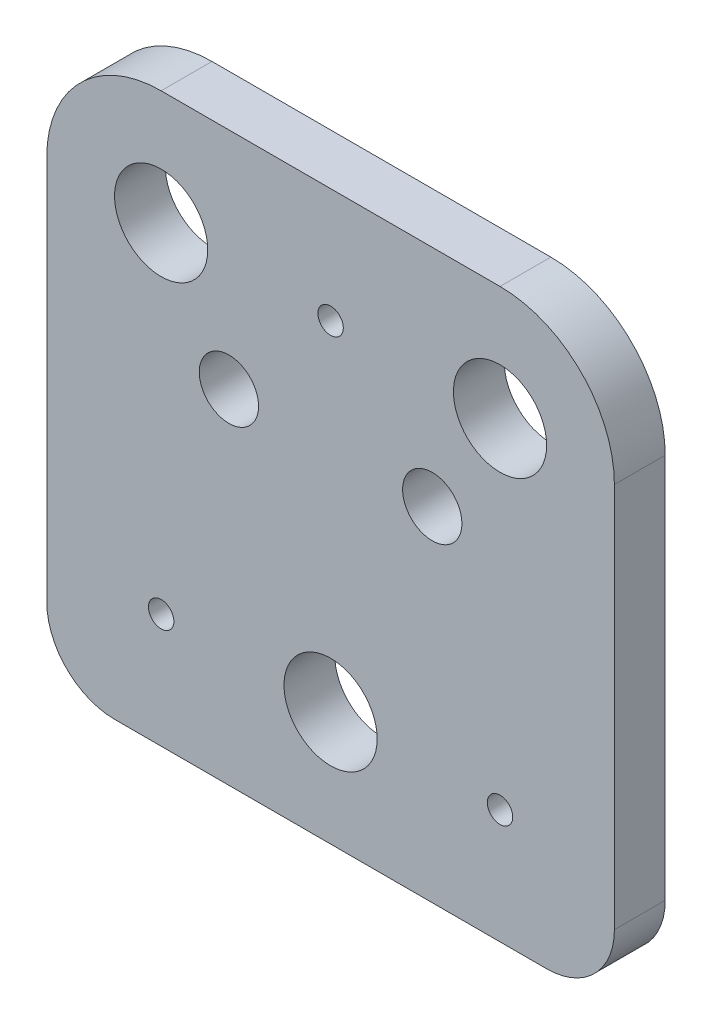
ISO-10303-21;
HEADER;
FILE_DESCRIPTION(('STEP AP214'),'2;1');
FILE_NAME('part.step','',(''),(''),'','','');
FILE_SCHEMA(('AUTOMOTIVE_DESIGN { 1 0 10303 214 1 1 1 1 }'));
ENDSEC;
DATA;
#1=APPLICATION_CONTEXT('core data for automotive mechanical design processes');
#2=APPLICATION_PROTOCOL_DEFINITION('international standard','automotive_design',2000,#1);
#3=PRODUCT_CONTEXT('',#1,'mechanical');
#4=PRODUCT('Part','Part','',(#3));
#5=PRODUCT_RELATED_PRODUCT_CATEGORY('part','',(#4));
#6=PRODUCT_DEFINITION_FORMATION('','',#4);
#7=PRODUCT_DEFINITION_CONTEXT('part definition',#1,'design');
#8=PRODUCT_DEFINITION('design','',#6,#7);
#9=PRODUCT_DEFINITION_SHAPE('','',#8);
#10=(LENGTH_UNIT() NAMED_UNIT(*) SI_UNIT(.MILLI.,.METRE.));
#11=(NAMED_UNIT(*) PLANE_ANGLE_UNIT() SI_UNIT($,.RADIAN.));
#12=(NAMED_UNIT(*) SI_UNIT($,.STERADIAN.) SOLID_ANGLE_UNIT());
#13=UNCERTAINTY_MEASURE_WITH_UNIT(LENGTH_MEASURE(1.E-05),#10,'distance_accuracy_value','');
#14=(GEOMETRIC_REPRESENTATION_CONTEXT(3) GLOBAL_UNCERTAINTY_ASSIGNED_CONTEXT((#13)) GLOBAL_UNIT_ASSIGNED_CONTEXT((#10,
#11,#12)) REPRESENTATION_CONTEXT('',''));
#15=CARTESIAN_POINT('',(0.,0.,0.));
#16=DIRECTION('',(0.,0.,1.));
#17=DIRECTION('',(1.,0.,0.));
#18=AXIS2_PLACEMENT_3D('',#15,#16,#17);
#19=CARTESIAN_POINT('',(20.,20.,6.));
#20=DIRECTION('',(0.,0.,1.));
#21=DIRECTION('',(1.,0.,0.));
#22=AXIS2_PLACEMENT_3D('',#19,#20,#21);
#23=PLANE('',#22);
#24=CARTESIAN_POINT('',(-12.,6.99999999999999,6.));
#25=DIRECTION('',(0.,0.,1.));
#26=DIRECTION('',(1.,0.,0.));
#27=AXIS2_PLACEMENT_3D('',#24,#25,#26);
#28=CIRCLE('',#27,3.5);
#29=CARTESIAN_POINT('',(-8.49999999999998,6.99999999999999,6.));
#30=VERTEX_POINT('',#29);
#31=EDGE_CURVE('E218',#30,#30,#28,.T.);
#32=ORIENTED_EDGE('',*,*,#31,.F.);
#33=EDGE_LOOP('',(#32));
#34=FACE_BOUND('',#33,.T.);
#35=CARTESIAN_POINT('',(12.,6.99999999999999,6.));
#36=DIRECTION('',(0.,0.,1.));
#37=DIRECTION('',(1.,0.,0.));
#38=AXIS2_PLACEMENT_3D('',#35,#36,#37);
#39=CIRCLE('',#38,3.5);
#40=CARTESIAN_POINT('',(15.5,6.99999999999999,6.));
#41=VERTEX_POINT('',#40);
#42=EDGE_CURVE('E219',#41,#41,#39,.T.);
#43=ORIENTED_EDGE('',*,*,#42,.F.);
#44=EDGE_LOOP('',(#43));
#45=FACE_BOUND('',#44,.T.);
#46=CARTESIAN_POINT('',(-20.,-20.,6.));
#47=DIRECTION('',(0.,0.,1.));
#48=DIRECTION('',(1.,0.,0.));
#49=AXIS2_PLACEMENT_3D('',#46,#47,#48);
#50=CIRCLE('',#49,1.5);
#51=CARTESIAN_POINT('',(-18.5,-20.,6.));
#52=VERTEX_POINT('',#51);
#53=EDGE_CURVE('E194',#52,#52,#50,.F.);
#54=ORIENTED_EDGE('',*,*,#53,.T.);
#55=EDGE_LOOP('',(#54));
#56=FACE_BOUND('',#55,.T.);
#57=CARTESIAN_POINT('',(20.,-20.,6.));
#58=DIRECTION('',(0.,0.,1.));
#59=DIRECTION('',(1.,0.,0.));
#60=AXIS2_PLACEMENT_3D('',#57,#58,#59);
#61=CIRCLE('',#60,1.5);
#62=CARTESIAN_POINT('',(21.5,-20.,6.));
#63=VERTEX_POINT('',#62);
#64=EDGE_CURVE('E205',#63,#63,#61,.F.);
#65=ORIENTED_EDGE('',*,*,#64,.T.);
#66=EDGE_LOOP('',(#65));
#67=FACE_BOUND('',#66,.T.);
#68=CARTESIAN_POINT('',(0.,20.,6.));
#69=DIRECTION('',(0.,0.,1.));
#70=DIRECTION('',(1.,0.,0.));
#71=AXIS2_PLACEMENT_3D('',#68,#69,#70);
#72=CIRCLE('',#71,1.5);
#73=CARTESIAN_POINT('',(1.5,20.,6.));
#74=VERTEX_POINT('',#73);
#75=EDGE_CURVE('E197',#74,#74,#72,.F.);
#76=ORIENTED_EDGE('',*,*,#75,.T.);
#77=EDGE_LOOP('',(#76));
#78=FACE_BOUND('',#77,.T.);
#79=DIRECTION('',(0.,-1.,0.));
#80=VECTOR('',#79,1.);
#81=CARTESIAN_POINT('',(-33.5,-20.,6.));
#82=LINE('',#81,#80);
#83=CARTESIAN_POINT('',(-33.5,20.,6.));
#84=VERTEX_POINT('',#83);
#85=CARTESIAN_POINT('',(-33.5,-25.5,6.));
#86=VERTEX_POINT('',#85);
#87=EDGE_CURVE('E142',#84,#86,#82,.T.);
#88=ORIENTED_EDGE('',*,*,#87,.T.);
#89=CARTESIAN_POINT('',(-25.5,-25.5,6.));
#90=DIRECTION('',(0.,0.,1.));
#91=DIRECTION('',(1.,0.,0.));
#92=AXIS2_PLACEMENT_3D('',#89,#90,#91);
#93=CIRCLE('',#92,8.);
#94=CARTESIAN_POINT('',(-25.5,-33.5,6.));
#95=VERTEX_POINT('',#94);
#96=EDGE_CURVE('E41',#86,#95,#93,.T.);
#97=ORIENTED_EDGE('',*,*,#96,.T.);
#98=DIRECTION('',(1.,0.,0.));
#99=VECTOR('',#98,1.);
#100=CARTESIAN_POINT('',(20.,-33.5,6.));
#101=LINE('',#100,#99);
#102=CARTESIAN_POINT('',(25.5,-33.5,6.));
#103=VERTEX_POINT('',#102);
#104=EDGE_CURVE('E141',#95,#103,#101,.T.);
#105=ORIENTED_EDGE('',*,*,#104,.T.);
#106=CARTESIAN_POINT('',(25.5,-25.5,6.));
#107=DIRECTION('',(0.,0.,1.));
#108=DIRECTION('',(1.,0.,0.));
#109=AXIS2_PLACEMENT_3D('',#106,#107,#108);
#110=CIRCLE('',#109,8.);
#111=CARTESIAN_POINT('',(33.5,-25.5,6.));
#112=VERTEX_POINT('',#111);
#113=EDGE_CURVE('E48',#103,#112,#110,.T.);
#114=ORIENTED_EDGE('',*,*,#113,.T.);
#115=DIRECTION('',(0.,1.,0.));
#116=VECTOR('',#115,1.);
#117=CARTESIAN_POINT('',(33.5,-20.,6.));
#118=LINE('',#117,#116);
#119=CARTESIAN_POINT('',(33.5,20.,6.));
#120=VERTEX_POINT('',#119);
#121=EDGE_CURVE('E115',#112,#120,#118,.T.);
#122=ORIENTED_EDGE('',*,*,#121,.T.);
#123=CARTESIAN_POINT('',(20.,20.,6.));
#124=DIRECTION('',(0.,0.,1.));
#125=DIRECTION('',(1.,0.,0.));
#126=AXIS2_PLACEMENT_3D('',#123,#124,#125);
#127=CIRCLE('',#126,13.5);
#128=CARTESIAN_POINT('',(20.,33.5,6.));
#129=VERTEX_POINT('',#128);
#130=EDGE_CURVE('E111',#120,#129,#127,.T.);
#131=ORIENTED_EDGE('',*,*,#130,.T.);
#132=DIRECTION('',(-1.,0.,0.));
#133=VECTOR('',#132,1.);
#134=CARTESIAN_POINT('',(-20.,33.5,6.));
#135=LINE('',#134,#133);
#136=CARTESIAN_POINT('',(-20.,33.5,6.));
#137=VERTEX_POINT('',#136);
#138=EDGE_CURVE('E101',#129,#137,#135,.T.);
#139=ORIENTED_EDGE('',*,*,#138,.T.);
#140=CARTESIAN_POINT('',(-20.,20.,6.));
#141=DIRECTION('',(0.,0.,1.));
#142=DIRECTION('',(1.,0.,0.));
#143=AXIS2_PLACEMENT_3D('',#140,#141,#142);
#144=CIRCLE('',#143,13.5);
#145=EDGE_CURVE('E110',#137,#84,#144,.T.);
#146=ORIENTED_EDGE('',*,*,#145,.T.);
#147=EDGE_LOOP('',(#88,#97,#105,#114,#122,#131,#139,#146));
#148=FACE_BOUND('',#147,.T.);
#149=CARTESIAN_POINT('',(20.,20.,6.));
#150=DIRECTION('',(0.,0.,1.));
#151=DIRECTION('',(1.,0.,0.));
#152=AXIS2_PLACEMENT_3D('',#149,#150,#151);
#153=CIRCLE('',#152,5.5);
#154=CARTESIAN_POINT('',(25.5,20.,6.));
#155=VERTEX_POINT('',#154);
#156=EDGE_CURVE('E182',#155,#155,#153,.T.);
#157=ORIENTED_EDGE('',*,*,#156,.F.);
#158=EDGE_LOOP('',(#157));
#159=FACE_BOUND('',#158,.T.);
#160=CARTESIAN_POINT('',(-20.,20.,6.));
#161=DIRECTION('',(0.,0.,1.));
#162=DIRECTION('',(1.,0.,0.));
#163=AXIS2_PLACEMENT_3D('',#160,#161,#162);
#164=CIRCLE('',#163,5.5);
#165=CARTESIAN_POINT('',(-14.5,20.,6.));
#166=VERTEX_POINT('',#165);
#167=EDGE_CURVE('E174',#166,#166,#164,.T.);
#168=ORIENTED_EDGE('',*,*,#167,.F.);
#169=EDGE_LOOP('',(#168));
#170=FACE_BOUND('',#169,.T.);
#171=CARTESIAN_POINT('',(0.,-20.,6.));
#172=DIRECTION('',(0.,0.,1.));
#173=DIRECTION('',(1.,0.,0.));
#174=AXIS2_PLACEMENT_3D('',#171,#172,#173);
#175=CIRCLE('',#174,5.5);
#176=CARTESIAN_POINT('',(5.5,-20.,6.));
#177=VERTEX_POINT('',#176);
#178=EDGE_CURVE('E188',#177,#177,#175,.T.);
#179=ORIENTED_EDGE('',*,*,#178,.F.);
#180=EDGE_LOOP('',(#179));
#181=FACE_BOUND('',#180,.T.);
#182=ADVANCED_FACE('F33',(#34,#45,#56,#67,#78,#148,#159,#170,#181),#23,.T.);
#183=CARTESIAN_POINT('',(20.,20.,0.));
#184=DIRECTION('',(0.,0.,1.));
#185=DIRECTION('',(1.,0.,0.));
#186=AXIS2_PLACEMENT_3D('',#183,#184,#185);
#187=PLANE('',#186);
#188=CARTESIAN_POINT('',(-12.,6.99999999999999,0.));
#189=DIRECTION('',(0.,0.,1.));
#190=DIRECTION('',(1.,0.,0.));
#191=AXIS2_PLACEMENT_3D('',#188,#189,#190);
#192=CIRCLE('',#191,3.5);
#193=CARTESIAN_POINT('',(-8.49999999999998,6.99999999999999,0.));
#194=VERTEX_POINT('',#193);
#195=EDGE_CURVE('E204',#194,#194,#192,.F.);
#196=ORIENTED_EDGE('',*,*,#195,.F.);
#197=EDGE_LOOP('',(#196));
#198=FACE_BOUND('',#197,.T.);
#199=CARTESIAN_POINT('',(12.,6.99999999999999,0.));
#200=DIRECTION('',(0.,0.,1.));
#201=DIRECTION('',(1.,0.,0.));
#202=AXIS2_PLACEMENT_3D('',#199,#200,#201);
#203=CIRCLE('',#202,3.5);
#204=CARTESIAN_POINT('',(15.5,6.99999999999999,0.));
#205=VERTEX_POINT('',#204);
#206=EDGE_CURVE('E215',#205,#205,#203,.F.);
#207=ORIENTED_EDGE('',*,*,#206,.F.);
#208=EDGE_LOOP('',(#207));
#209=FACE_BOUND('',#208,.T.);
#210=CARTESIAN_POINT('',(-20.,-20.,0.));
#211=DIRECTION('',(0.,0.,-1.));
#212=DIRECTION('',(-1.,0.,0.));
#213=AXIS2_PLACEMENT_3D('',#210,#211,#212);
#214=CIRCLE('',#213,1.5);
#215=CARTESIAN_POINT('',(-21.5,-20.,0.));
#216=VERTEX_POINT('',#215);
#217=EDGE_CURVE('E208',#216,#216,#214,.T.);
#218=ORIENTED_EDGE('',*,*,#217,.F.);
#219=EDGE_LOOP('',(#218));
#220=FACE_BOUND('',#219,.T.);
#221=CARTESIAN_POINT('',(20.,-20.,0.));
#222=DIRECTION('',(0.,0.,-1.));
#223=DIRECTION('',(-1.,0.,0.));
#224=AXIS2_PLACEMENT_3D('',#221,#222,#223);
#225=CIRCLE('',#224,1.5);
#226=CARTESIAN_POINT('',(18.5,-20.,0.));
#227=VERTEX_POINT('',#226);
#228=EDGE_CURVE('E200',#227,#227,#225,.T.);
#229=ORIENTED_EDGE('',*,*,#228,.F.);
#230=EDGE_LOOP('',(#229));
#231=FACE_BOUND('',#230,.T.);
#232=CARTESIAN_POINT('',(0.,20.,0.));
#233=DIRECTION('',(0.,0.,-1.));
#234=DIRECTION('',(-1.,0.,0.));
#235=AXIS2_PLACEMENT_3D('',#232,#233,#234);
#236=CIRCLE('',#235,1.5);
#237=CARTESIAN_POINT('',(-1.5,20.,0.));
#238=VERTEX_POINT('',#237);
#239=EDGE_CURVE('E201',#238,#238,#236,.T.);
#240=ORIENTED_EDGE('',*,*,#239,.F.);
#241=EDGE_LOOP('',(#240));
#242=FACE_BOUND('',#241,.T.);
#243=DIRECTION('',(1.,0.,0.));
#244=VECTOR('',#243,1.);
#245=CARTESIAN_POINT('',(20.,-33.5,0.));
#246=LINE('',#245,#244);
#247=CARTESIAN_POINT('',(-25.5,-33.5,0.));
#248=VERTEX_POINT('',#247);
#249=CARTESIAN_POINT('',(25.5,-33.5,0.));
#250=VERTEX_POINT('',#249);
#251=EDGE_CURVE('E158',#248,#250,#246,.T.);
#252=ORIENTED_EDGE('',*,*,#251,.F.);
#253=CARTESIAN_POINT('',(-25.5,-25.5,0.));
#254=DIRECTION('',(0.,0.,1.));
#255=DIRECTION('',(1.,0.,0.));
#256=AXIS2_PLACEMENT_3D('',#253,#254,#255);
#257=CIRCLE('',#256,8.);
#258=CARTESIAN_POINT('',(-33.5,-25.5,0.));
#259=VERTEX_POINT('',#258);
#260=EDGE_CURVE('E136',#248,#259,#257,.F.);
#261=ORIENTED_EDGE('',*,*,#260,.T.);
#262=DIRECTION('',(0.,-1.,0.));
#263=VECTOR('',#262,1.);
#264=CARTESIAN_POINT('',(-33.5,-20.,0.));
#265=LINE('',#264,#263);
#266=CARTESIAN_POINT('',(-33.5,20.,0.));
#267=VERTEX_POINT('',#266);
#268=EDGE_CURVE('E157',#267,#259,#265,.T.);
#269=ORIENTED_EDGE('',*,*,#268,.F.);
#270=CARTESIAN_POINT('',(-20.,20.,0.));
#271=DIRECTION('',(0.,0.,1.));
#272=DIRECTION('',(1.,0.,0.));
#273=AXIS2_PLACEMENT_3D('',#270,#271,#272);
#274=CIRCLE('',#273,13.5);
#275=CARTESIAN_POINT('',(-20.,33.5,0.));
#276=VERTEX_POINT('',#275);
#277=EDGE_CURVE('E162',#276,#267,#274,.T.);
#278=ORIENTED_EDGE('',*,*,#277,.F.);
#279=DIRECTION('',(-1.,0.,0.));
#280=VECTOR('',#279,1.);
#281=CARTESIAN_POINT('',(-20.,33.5,0.));
#282=LINE('',#281,#280);
#283=CARTESIAN_POINT('',(20.,33.5,0.));
#284=VERTEX_POINT('',#283);
#285=EDGE_CURVE('E165',#284,#276,#282,.T.);
#286=ORIENTED_EDGE('',*,*,#285,.F.);
#287=CARTESIAN_POINT('',(20.,20.,0.));
#288=DIRECTION('',(0.,0.,1.));
#289=DIRECTION('',(1.,0.,0.));
#290=AXIS2_PLACEMENT_3D('',#287,#288,#289);
#291=CIRCLE('',#290,13.5);
#292=CARTESIAN_POINT('',(33.5,20.,0.));
#293=VERTEX_POINT('',#292);
#294=EDGE_CURVE('E123',#293,#284,#291,.T.);
#295=ORIENTED_EDGE('',*,*,#294,.F.);
#296=DIRECTION('',(0.,1.,0.));
#297=VECTOR('',#296,1.);
#298=CARTESIAN_POINT('',(33.5,-20.,0.));
#299=LINE('',#298,#297);
#300=CARTESIAN_POINT('',(33.5,-25.5,0.));
#301=VERTEX_POINT('',#300);
#302=EDGE_CURVE('E119',#301,#293,#299,.T.);
#303=ORIENTED_EDGE('',*,*,#302,.F.);
#304=CARTESIAN_POINT('',(25.5,-25.5,0.));
#305=DIRECTION('',(0.,0.,1.));
#306=DIRECTION('',(1.,0.,0.));
#307=AXIS2_PLACEMENT_3D('',#304,#305,#306);
#308=CIRCLE('',#307,8.);
#309=EDGE_CURVE('E134',#301,#250,#308,.F.);
#310=ORIENTED_EDGE('',*,*,#309,.T.);
#311=EDGE_LOOP('',(#252,#261,#269,#278,#286,#295,#303,#310));
#312=FACE_BOUND('',#311,.T.);
#313=CARTESIAN_POINT('',(-20.,20.,0.));
#314=DIRECTION('',(0.,0.,1.));
#315=DIRECTION('',(1.,0.,0.));
#316=AXIS2_PLACEMENT_3D('',#313,#314,#315);
#317=CIRCLE('',#316,5.5);
#318=CARTESIAN_POINT('',(-14.5,20.,0.));
#319=VERTEX_POINT('',#318);
#320=EDGE_CURVE('E179',#319,#319,#317,.T.);
#321=ORIENTED_EDGE('',*,*,#320,.T.);
#322=EDGE_LOOP('',(#321));
#323=FACE_BOUND('',#322,.T.);
#324=CARTESIAN_POINT('',(20.,20.,0.));
#325=DIRECTION('',(0.,0.,1.));
#326=DIRECTION('',(1.,0.,0.));
#327=AXIS2_PLACEMENT_3D('',#324,#325,#326);
#328=CIRCLE('',#327,5.5);
#329=CARTESIAN_POINT('',(25.5,20.,0.));
#330=VERTEX_POINT('',#329);
#331=EDGE_CURVE('E185',#330,#330,#328,.T.);
#332=ORIENTED_EDGE('',*,*,#331,.T.);
#333=EDGE_LOOP('',(#332));
#334=FACE_BOUND('',#333,.T.);
#335=CARTESIAN_POINT('',(0.,-20.,0.));
#336=DIRECTION('',(0.,0.,1.));
#337=DIRECTION('',(1.,0.,0.));
#338=AXIS2_PLACEMENT_3D('',#335,#336,#337);
#339=CIRCLE('',#338,5.5);
#340=CARTESIAN_POINT('',(5.5,-20.,0.));
#341=VERTEX_POINT('',#340);
#342=EDGE_CURVE('E191',#341,#341,#339,.T.);
#343=ORIENTED_EDGE('',*,*,#342,.T.);
#344=EDGE_LOOP('',(#343));
#345=FACE_BOUND('',#344,.T.);
#346=ADVANCED_FACE('F154',(#198,#209,#220,#231,#242,#312,#323,#334,#345),#187,.F.);
#347=CARTESIAN_POINT('',(20.,20.,6.));
#348=DIRECTION('',(0.,0.,-1.));
#349=DIRECTION('',(-1.,0.,0.));
#350=AXIS2_PLACEMENT_3D('',#347,#348,#349);
#351=CYLINDRICAL_SURFACE('',#350,13.5);
#352=ORIENTED_EDGE('',*,*,#294,.T.);
#353=DIRECTION('',(0.,0.,-1.));
#354=VECTOR('',#353,1.);
#355=CARTESIAN_POINT('',(20.,33.5,6.));
#356=LINE('',#355,#354);
#357=EDGE_CURVE('E105',#129,#284,#356,.T.);
#358=ORIENTED_EDGE('',*,*,#357,.F.);
#359=ORIENTED_EDGE('',*,*,#130,.F.);
#360=DIRECTION('',(0.,0.,-1.));
#361=VECTOR('',#360,1.);
#362=CARTESIAN_POINT('',(33.5,20.,6.));
#363=LINE('',#362,#361);
#364=EDGE_CURVE('E170',#120,#293,#363,.T.);
#365=ORIENTED_EDGE('',*,*,#364,.T.);
#366=EDGE_LOOP('',(#352,#358,#359,#365));
#367=FACE_BOUND('',#366,.T.);
#368=ADVANCED_FACE('F121',(#367),#351,.T.);
#369=CARTESIAN_POINT('',(-20.,33.5,6.));
#370=DIRECTION('',(0.,-1.,0.));
#371=DIRECTION('',(1.,0.,0.));
#372=AXIS2_PLACEMENT_3D('',#369,#370,#371);
#373=PLANE('',#372);
#374=ORIENTED_EDGE('',*,*,#285,.T.);
#375=DIRECTION('',(0.,0.,-1.));
#376=VECTOR('',#375,1.);
#377=CARTESIAN_POINT('',(-20.,33.5,6.));
#378=LINE('',#377,#376);
#379=EDGE_CURVE('E108',#137,#276,#378,.T.);
#380=ORIENTED_EDGE('',*,*,#379,.F.);
#381=ORIENTED_EDGE('',*,*,#138,.F.);
#382=ORIENTED_EDGE('',*,*,#357,.T.);
#383=EDGE_LOOP('',(#374,#380,#381,#382));
#384=FACE_BOUND('',#383,.T.);
#385=ADVANCED_FACE('F103',(#384),#373,.F.);
#386=CARTESIAN_POINT('',(-20.,20.,6.));
#387=DIRECTION('',(0.,0.,-1.));
#388=DIRECTION('',(-1.,0.,0.));
#389=AXIS2_PLACEMENT_3D('',#386,#387,#388);
#390=CYLINDRICAL_SURFACE('',#389,13.5);
#391=ORIENTED_EDGE('',*,*,#277,.T.);
#392=DIRECTION('',(0.,0.,-1.));
#393=VECTOR('',#392,1.);
#394=CARTESIAN_POINT('',(-33.5,20.,6.));
#395=LINE('',#394,#393);
#396=EDGE_CURVE('E128',#84,#267,#395,.T.);
#397=ORIENTED_EDGE('',*,*,#396,.F.);
#398=ORIENTED_EDGE('',*,*,#145,.F.);
#399=ORIENTED_EDGE('',*,*,#379,.T.);
#400=EDGE_LOOP('',(#391,#397,#398,#399));
#401=FACE_BOUND('',#400,.T.);
#402=ADVANCED_FACE('F176',(#401),#390,.T.);
#403=CARTESIAN_POINT('',(-33.5,-20.,6.));
#404=DIRECTION('',(1.,0.,0.));
#405=DIRECTION('',(0.,0.,-1.));
#406=AXIS2_PLACEMENT_3D('',#403,#404,#405);
#407=PLANE('',#406);
#408=ORIENTED_EDGE('',*,*,#268,.T.);
#409=DIRECTION('',(0.,0.,-1.));
#410=VECTOR('',#409,1.);
#411=CARTESIAN_POINT('',(-33.5,-25.5,6.));
#412=LINE('',#411,#410);
#413=EDGE_CURVE('E56',#259,#86,#412,.F.);
#414=ORIENTED_EDGE('',*,*,#413,.T.);
#415=ORIENTED_EDGE('',*,*,#87,.F.);
#416=ORIENTED_EDGE('',*,*,#396,.T.);
#417=EDGE_LOOP('',(#408,#414,#415,#416));
#418=FACE_BOUND('',#417,.T.);
#419=ADVANCED_FACE('F160',(#418),#407,.F.);
#420=CARTESIAN_POINT('',(20.,-33.5,6.));
#421=DIRECTION('',(0.,1.,0.));
#422=DIRECTION('',(0.,0.,1.));
#423=AXIS2_PLACEMENT_3D('',#420,#421,#422);
#424=PLANE('',#423);
#425=ORIENTED_EDGE('',*,*,#104,.F.);
#426=DIRECTION('',(0.,0.,-1.));
#427=VECTOR('',#426,1.);
#428=CARTESIAN_POINT('',(-25.5,-33.5,6.));
#429=LINE('',#428,#427);
#430=EDGE_CURVE('E126',#95,#248,#429,.T.);
#431=ORIENTED_EDGE('',*,*,#430,.T.);
#432=ORIENTED_EDGE('',*,*,#251,.T.);
#433=DIRECTION('',(0.,0.,-1.));
#434=VECTOR('',#433,1.);
#435=CARTESIAN_POINT('',(25.5,-33.5,6.));
#436=LINE('',#435,#434);
#437=EDGE_CURVE('E124',#250,#103,#436,.F.);
#438=ORIENTED_EDGE('',*,*,#437,.T.);
#439=EDGE_LOOP('',(#425,#431,#432,#438));
#440=FACE_BOUND('',#439,.T.);
#441=ADVANCED_FACE('F146',(#440),#424,.F.);
#442=CARTESIAN_POINT('',(33.5,-20.,6.));
#443=DIRECTION('',(-1.,0.,0.));
#444=DIRECTION('',(0.,-1.,0.));
#445=AXIS2_PLACEMENT_3D('',#442,#443,#444);
#446=PLANE('',#445);
#447=ORIENTED_EDGE('',*,*,#121,.F.);
#448=DIRECTION('',(0.,0.,-1.));
#449=VECTOR('',#448,1.);
#450=CARTESIAN_POINT('',(33.5,-25.5,6.));
#451=LINE('',#450,#449);
#452=EDGE_CURVE('E11',#112,#301,#451,.T.);
#453=ORIENTED_EDGE('',*,*,#452,.T.);
#454=ORIENTED_EDGE('',*,*,#302,.T.);
#455=ORIENTED_EDGE('',*,*,#364,.F.);
#456=EDGE_LOOP('',(#447,#453,#454,#455));
#457=FACE_BOUND('',#456,.T.);
#458=ADVANCED_FACE('F265',(#457),#446,.F.);
#459=CARTESIAN_POINT('',(-20.,20.,6.));
#460=DIRECTION('',(0.,0.,-1.));
#461=DIRECTION('',(-1.,0.,0.));
#462=AXIS2_PLACEMENT_3D('',#459,#460,#461);
#463=CYLINDRICAL_SURFACE('',#462,5.5);
#464=ORIENTED_EDGE('',*,*,#167,.T.);
#465=EDGE_LOOP('',(#464));
#466=FACE_BOUND('',#465,.T.);
#467=ORIENTED_EDGE('',*,*,#320,.F.);
#468=EDGE_LOOP('',(#467));
#469=FACE_BOUND('',#468,.T.);
#470=ADVANCED_FACE('F262',(#466,#469),#463,.F.);
#471=CARTESIAN_POINT('',(20.,20.,6.));
#472=DIRECTION('',(0.,0.,-1.));
#473=DIRECTION('',(-1.,0.,0.));
#474=AXIS2_PLACEMENT_3D('',#471,#472,#473);
#475=CYLINDRICAL_SURFACE('',#474,5.5);
#476=ORIENTED_EDGE('',*,*,#156,.T.);
#477=EDGE_LOOP('',(#476));
#478=FACE_BOUND('',#477,.T.);
#479=ORIENTED_EDGE('',*,*,#331,.F.);
#480=EDGE_LOOP('',(#479));
#481=FACE_BOUND('',#480,.T.);
#482=ADVANCED_FACE('F258',(#478,#481),#475,.F.);
#483=CARTESIAN_POINT('',(0.,-20.,6.));
#484=DIRECTION('',(0.,0.,-1.));
#485=DIRECTION('',(-1.,0.,0.));
#486=AXIS2_PLACEMENT_3D('',#483,#484,#485);
#487=CYLINDRICAL_SURFACE('',#486,5.5);
#488=ORIENTED_EDGE('',*,*,#178,.T.);
#489=EDGE_LOOP('',(#488));
#490=FACE_BOUND('',#489,.T.);
#491=ORIENTED_EDGE('',*,*,#342,.F.);
#492=EDGE_LOOP('',(#491));
#493=FACE_BOUND('',#492,.T.);
#494=ADVANCED_FACE('F255',(#490,#493),#487,.F.);
#495=CARTESIAN_POINT('',(-25.5,-25.5,6.));
#496=DIRECTION('',(0.,0.,-1.));
#497=DIRECTION('',(-1.,0.,0.));
#498=AXIS2_PLACEMENT_3D('',#495,#496,#497);
#499=CYLINDRICAL_SURFACE('',#498,8.);
#500=ORIENTED_EDGE('',*,*,#96,.F.);
#501=ORIENTED_EDGE('',*,*,#413,.F.);
#502=ORIENTED_EDGE('',*,*,#260,.F.);
#503=ORIENTED_EDGE('',*,*,#430,.F.);
#504=EDGE_LOOP('',(#500,#501,#502,#503));
#505=FACE_BOUND('',#504,.T.);
#506=ADVANCED_FACE('F151',(#505),#499,.T.);
#507=CARTESIAN_POINT('',(25.5,-25.5,6.));
#508=DIRECTION('',(0.,0.,-1.));
#509=DIRECTION('',(-1.,0.,0.));
#510=AXIS2_PLACEMENT_3D('',#507,#508,#509);
#511=CYLINDRICAL_SURFACE('',#510,8.);
#512=ORIENTED_EDGE('',*,*,#113,.F.);
#513=ORIENTED_EDGE('',*,*,#437,.F.);
#514=ORIENTED_EDGE('',*,*,#309,.F.);
#515=ORIENTED_EDGE('',*,*,#452,.F.);
#516=EDGE_LOOP('',(#512,#513,#514,#515));
#517=FACE_BOUND('',#516,.T.);
#518=ADVANCED_FACE('F35',(#517),#511,.T.);
#519=CARTESIAN_POINT('',(0.,20.,10.2426406871193));
#520=DIRECTION('',(0.,0.,-1.));
#521=DIRECTION('',(-1.,0.,0.));
#522=AXIS2_PLACEMENT_3D('',#519,#520,#521);
#523=CYLINDRICAL_SURFACE('',#522,1.5);
#524=ORIENTED_EDGE('',*,*,#239,.T.);
#525=EDGE_LOOP('',(#524));
#526=FACE_BOUND('',#525,.T.);
#527=ORIENTED_EDGE('',*,*,#75,.F.);
#528=EDGE_LOOP('',(#527));
#529=FACE_BOUND('',#528,.T.);
#530=ADVANCED_FACE('F240',(#526,#529),#523,.F.);
#531=CARTESIAN_POINT('',(20.,-20.,10.2426406871193));
#532=DIRECTION('',(0.,0.,-1.));
#533=DIRECTION('',(-1.,0.,0.));
#534=AXIS2_PLACEMENT_3D('',#531,#532,#533);
#535=CYLINDRICAL_SURFACE('',#534,1.5);
#536=ORIENTED_EDGE('',*,*,#228,.T.);
#537=EDGE_LOOP('',(#536));
#538=FACE_BOUND('',#537,.T.);
#539=ORIENTED_EDGE('',*,*,#64,.F.);
#540=EDGE_LOOP('',(#539));
#541=FACE_BOUND('',#540,.T.);
#542=ADVANCED_FACE('F242',(#538,#541),#535,.F.);
#543=CARTESIAN_POINT('',(-20.,-20.,10.2426406871193));
#544=DIRECTION('',(0.,0.,-1.));
#545=DIRECTION('',(-1.,0.,0.));
#546=AXIS2_PLACEMENT_3D('',#543,#544,#545);
#547=CYLINDRICAL_SURFACE('',#546,1.5);
#548=ORIENTED_EDGE('',*,*,#217,.T.);
#549=EDGE_LOOP('',(#548));
#550=FACE_BOUND('',#549,.T.);
#551=ORIENTED_EDGE('',*,*,#53,.F.);
#552=EDGE_LOOP('',(#551));
#553=FACE_BOUND('',#552,.T.);
#554=ADVANCED_FACE('F249',(#550,#553),#547,.F.);
#555=CARTESIAN_POINT('',(12.,6.99999999999999,-9.89949493661166));
#556=DIRECTION('',(0.,0.,1.));
#557=DIRECTION('',(1.,0.,0.));
#558=AXIS2_PLACEMENT_3D('',#555,#556,#557);
#559=CYLINDRICAL_SURFACE('',#558,3.5);
#560=ORIENTED_EDGE('',*,*,#206,.T.);
#561=EDGE_LOOP('',(#560));
#562=FACE_BOUND('',#561,.T.);
#563=ORIENTED_EDGE('',*,*,#42,.T.);
#564=EDGE_LOOP('',(#563));
#565=FACE_BOUND('',#564,.T.);
#566=ADVANCED_FACE('F312',(#562,#565),#559,.F.);
#567=CARTESIAN_POINT('',(-12.,6.99999999999999,-9.89949493661166));
#568=DIRECTION('',(0.,0.,1.));
#569=DIRECTION('',(1.,0.,0.));
#570=AXIS2_PLACEMENT_3D('',#567,#568,#569);
#571=CYLINDRICAL_SURFACE('',#570,3.5);
#572=ORIENTED_EDGE('',*,*,#195,.T.);
#573=EDGE_LOOP('',(#572));
#574=FACE_BOUND('',#573,.T.);
#575=ORIENTED_EDGE('',*,*,#31,.T.);
#576=EDGE_LOOP('',(#575));
#577=FACE_BOUND('',#576,.T.);
#578=ADVANCED_FACE('F227',(#574,#577),#571,.F.);
#579=CLOSED_SHELL('',(#182,#346,#368,#385,#402,#419,#441,#458,#470,#482,#494,#506,#518,#530,
#542,#554,#566,#578));
#580=MANIFOLD_SOLID_BREP('B2',#579);
#581=ADVANCED_BREP_SHAPE_REPRESENTATION('',(#18,#580),#14);
#582=SHAPE_DEFINITION_REPRESENTATION(#9,#581);
ENDSEC;
END-ISO-10303-21;
